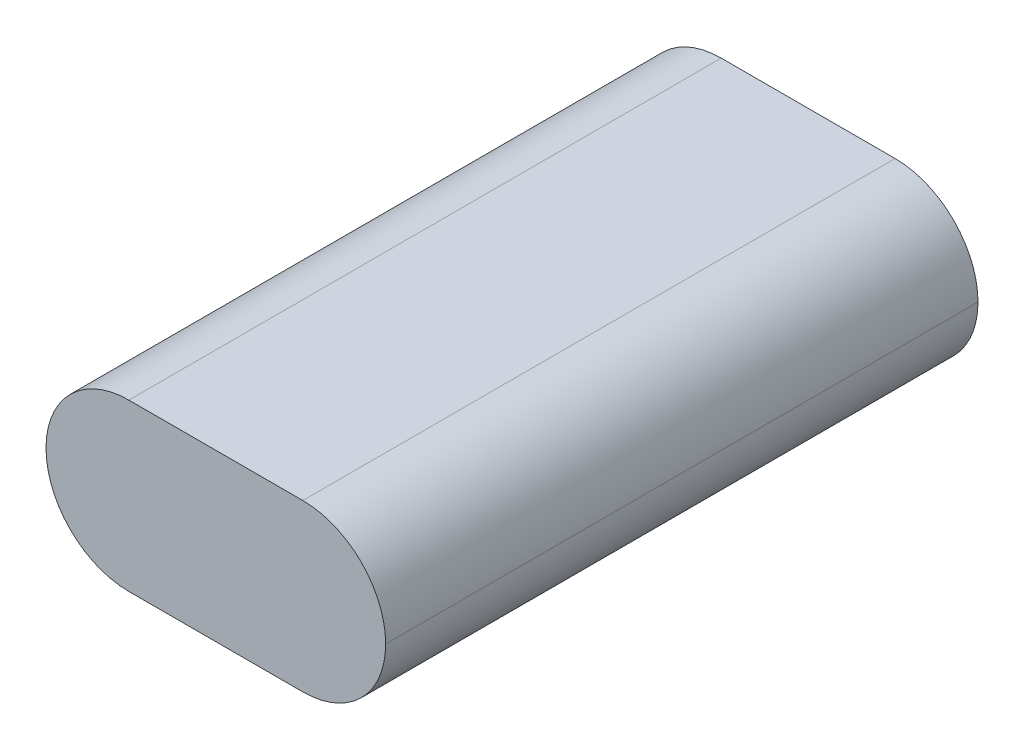
ISO-10303-21;
HEADER;
FILE_DESCRIPTION(('STEP AP214'),'2;1');
FILE_NAME('part.step','',(''),(''),'','','');
FILE_SCHEMA(('AUTOMOTIVE_DESIGN { 1 0 10303 214 1 1 1 1 }'));
ENDSEC;
DATA;
#1=APPLICATION_CONTEXT('core data for automotive mechanical design processes');
#2=APPLICATION_PROTOCOL_DEFINITION('international standard','automotive_design',2000,#1);
#3=PRODUCT_CONTEXT('',#1,'mechanical');
#4=PRODUCT('Part','Part','',(#3));
#5=PRODUCT_RELATED_PRODUCT_CATEGORY('part','',(#4));
#6=PRODUCT_DEFINITION_FORMATION('','',#4);
#7=PRODUCT_DEFINITION_CONTEXT('part definition',#1,'design');
#8=PRODUCT_DEFINITION('design','',#6,#7);
#9=PRODUCT_DEFINITION_SHAPE('','',#8);
#10=(LENGTH_UNIT() NAMED_UNIT(*) SI_UNIT(.MILLI.,.METRE.));
#11=(NAMED_UNIT(*) PLANE_ANGLE_UNIT() SI_UNIT($,.RADIAN.));
#12=(NAMED_UNIT(*) SI_UNIT($,.STERADIAN.) SOLID_ANGLE_UNIT());
#13=UNCERTAINTY_MEASURE_WITH_UNIT(LENGTH_MEASURE(1.E-05),#10,'distance_accuracy_value','');
#14=(GEOMETRIC_REPRESENTATION_CONTEXT(3) GLOBAL_UNCERTAINTY_ASSIGNED_CONTEXT((#13)) GLOBAL_UNIT_ASSIGNED_CONTEXT((#10,
#11,#12)) REPRESENTATION_CONTEXT('',''));
#15=CARTESIAN_POINT('',(0.,0.,0.));
#16=DIRECTION('',(0.,0.,1.));
#17=DIRECTION('',(1.,0.,0.));
#18=AXIS2_PLACEMENT_3D('',#15,#16,#17);
#19=CARTESIAN_POINT('',(-18.75,9.15,-32.7));
#20=DIRECTION('',(0.,0.,1.));
#21=DIRECTION('',(1.,0.,0.));
#22=AXIS2_PLACEMENT_3D('',#19,#20,#21);
#23=PLANE('',#22);
#24=CARTESIAN_POINT('',(9.6,0.,-32.7));
#25=DIRECTION('',(0.,0.,1.));
#26=DIRECTION('',(1.,0.,0.));
#27=AXIS2_PLACEMENT_3D('',#24,#25,#26);
#28=CIRCLE('',#27,9.15);
#29=CARTESIAN_POINT('',(9.6,9.15,-32.7));
#30=VERTEX_POINT('',#29);
#31=CARTESIAN_POINT('',(18.75,0.,-32.7));
#32=VERTEX_POINT('',#31);
#33=EDGE_CURVE('E92',#30,#32,#28,.F.);
#34=ORIENTED_EDGE('',*,*,#33,.T.);
#35=CARTESIAN_POINT('',(9.6,0.,-32.7));
#36=DIRECTION('',(0.,0.,1.));
#37=DIRECTION('',(1.,0.,0.));
#38=AXIS2_PLACEMENT_3D('',#35,#36,#37);
#39=CIRCLE('',#38,9.15);
#40=CARTESIAN_POINT('',(9.6,-9.15,-32.7));
#41=VERTEX_POINT('',#40);
#42=EDGE_CURVE('E87',#32,#41,#39,.F.);
#43=ORIENTED_EDGE('',*,*,#42,.T.);
#44=DIRECTION('',(-1.,0.,0.));
#45=VECTOR('',#44,1.);
#46=CARTESIAN_POINT('',(-18.75,-9.15,-32.7));
#47=LINE('',#46,#45);
#48=CARTESIAN_POINT('',(-9.6,-9.15,-32.7));
#49=VERTEX_POINT('',#48);
#50=EDGE_CURVE('E89',#41,#49,#47,.T.);
#51=ORIENTED_EDGE('',*,*,#50,.T.);
#52=CARTESIAN_POINT('',(-9.6,0.,-32.7));
#53=DIRECTION('',(0.,0.,1.));
#54=DIRECTION('',(1.,0.,0.));
#55=AXIS2_PLACEMENT_3D('',#52,#53,#54);
#56=CIRCLE('',#55,9.15);
#57=CARTESIAN_POINT('',(-18.75,0.,-32.7));
#58=VERTEX_POINT('',#57);
#59=EDGE_CURVE('E124',#49,#58,#56,.F.);
#60=ORIENTED_EDGE('',*,*,#59,.T.);
#61=CARTESIAN_POINT('',(-9.6,0.,-32.7));
#62=DIRECTION('',(0.,0.,1.));
#63=DIRECTION('',(1.,0.,0.));
#64=AXIS2_PLACEMENT_3D('',#61,#62,#63);
#65=CIRCLE('',#64,9.15);
#66=CARTESIAN_POINT('',(-9.6,9.15,-32.7));
#67=VERTEX_POINT('',#66);
#68=EDGE_CURVE('E128',#58,#67,#65,.F.);
#69=ORIENTED_EDGE('',*,*,#68,.T.);
#70=DIRECTION('',(-1.,0.,0.));
#71=VECTOR('',#70,1.);
#72=CARTESIAN_POINT('',(-18.75,9.15,-32.7));
#73=LINE('',#72,#71);
#74=EDGE_CURVE('E133',#30,#67,#73,.T.);
#75=ORIENTED_EDGE('',*,*,#74,.F.);
#76=EDGE_LOOP('',(#34,#43,#51,#60,#69,#75));
#77=FACE_BOUND('',#76,.T.);
#78=ADVANCED_FACE('F33',(#77),#23,.F.);
#79=CARTESIAN_POINT('',(-18.75,9.15,32.7));
#80=DIRECTION('',(0.,0.,-1.));
#81=DIRECTION('',(-1.,0.,0.));
#82=AXIS2_PLACEMENT_3D('',#79,#80,#81);
#83=PLANE('',#82);
#84=DIRECTION('',(1.,0.,0.));
#85=VECTOR('',#84,1.);
#86=CARTESIAN_POINT('',(-18.75,-9.15,32.7));
#87=LINE('',#86,#85);
#88=CARTESIAN_POINT('',(-9.6,-9.15,32.7));
#89=VERTEX_POINT('',#88);
#90=CARTESIAN_POINT('',(9.6,-9.15,32.7));
#91=VERTEX_POINT('',#90);
#92=EDGE_CURVE('E107',#89,#91,#87,.T.);
#93=ORIENTED_EDGE('',*,*,#92,.T.);
#94=CARTESIAN_POINT('',(9.6,0.,32.7));
#95=DIRECTION('',(0.,0.,-1.));
#96=DIRECTION('',(-1.,0.,0.));
#97=AXIS2_PLACEMENT_3D('',#94,#95,#96);
#98=CIRCLE('',#97,9.15);
#99=CARTESIAN_POINT('',(18.75,0.,32.7));
#100=VERTEX_POINT('',#99);
#101=EDGE_CURVE('E111',#91,#100,#98,.F.);
#102=ORIENTED_EDGE('',*,*,#101,.T.);
#103=CARTESIAN_POINT('',(9.6,0.,32.7));
#104=DIRECTION('',(0.,0.,-1.));
#105=DIRECTION('',(-1.,0.,0.));
#106=AXIS2_PLACEMENT_3D('',#103,#104,#105);
#107=CIRCLE('',#106,9.15);
#108=CARTESIAN_POINT('',(9.6,9.15,32.7));
#109=VERTEX_POINT('',#108);
#110=EDGE_CURVE('E56',#100,#109,#107,.F.);
#111=ORIENTED_EDGE('',*,*,#110,.T.);
#112=DIRECTION('',(1.,0.,0.));
#113=VECTOR('',#112,1.);
#114=CARTESIAN_POINT('',(-18.75,9.15,32.7));
#115=LINE('',#114,#113);
#116=CARTESIAN_POINT('',(-9.6,9.15,32.7));
#117=VERTEX_POINT('',#116);
#118=EDGE_CURVE('E130',#117,#109,#115,.T.);
#119=ORIENTED_EDGE('',*,*,#118,.F.);
#120=CARTESIAN_POINT('',(-9.6,0.,32.7));
#121=DIRECTION('',(0.,0.,-1.));
#122=DIRECTION('',(-1.,0.,0.));
#123=AXIS2_PLACEMENT_3D('',#120,#121,#122);
#124=CIRCLE('',#123,9.15);
#125=CARTESIAN_POINT('',(-18.75,0.,32.7));
#126=VERTEX_POINT('',#125);
#127=EDGE_CURVE('E50',#117,#126,#124,.F.);
#128=ORIENTED_EDGE('',*,*,#127,.T.);
#129=CARTESIAN_POINT('',(-9.6,0.,32.7));
#130=DIRECTION('',(0.,0.,-1.));
#131=DIRECTION('',(-1.,0.,0.));
#132=AXIS2_PLACEMENT_3D('',#129,#130,#131);
#133=CIRCLE('',#132,9.15);
#134=EDGE_CURVE('E113',#126,#89,#133,.F.);
#135=ORIENTED_EDGE('',*,*,#134,.T.);
#136=EDGE_LOOP('',(#93,#102,#111,#119,#128,#135));
#137=FACE_BOUND('',#136,.T.);
#138=ADVANCED_FACE('F152',(#137),#83,.F.);
#139=CARTESIAN_POINT('',(0.,9.15,0.));
#140=DIRECTION('',(0.,1.,0.));
#141=DIRECTION('',(0.,0.,1.));
#142=AXIS2_PLACEMENT_3D('',#139,#140,#141);
#143=PLANE('',#142);
#144=ORIENTED_EDGE('',*,*,#118,.T.);
#145=DIRECTION('',(0.,0.,-1.));
#146=VECTOR('',#145,1.);
#147=CARTESIAN_POINT('',(9.6,9.15,-32.7));
#148=LINE('',#147,#146);
#149=EDGE_CURVE('E11',#109,#30,#148,.T.);
#150=ORIENTED_EDGE('',*,*,#149,.T.);
#151=ORIENTED_EDGE('',*,*,#74,.T.);
#152=DIRECTION('',(0.,0.,1.));
#153=VECTOR('',#152,1.);
#154=CARTESIAN_POINT('',(-9.6,9.15,32.7));
#155=LINE('',#154,#153);
#156=EDGE_CURVE('E42',#67,#117,#155,.T.);
#157=ORIENTED_EDGE('',*,*,#156,.T.);
#158=EDGE_LOOP('',(#144,#150,#151,#157));
#159=FACE_BOUND('',#158,.T.);
#160=ADVANCED_FACE('F139',(#159),#143,.T.);
#161=CARTESIAN_POINT('',(0.,-9.15,0.));
#162=DIRECTION('',(0.,1.,0.));
#163=DIRECTION('',(0.,0.,1.));
#164=AXIS2_PLACEMENT_3D('',#161,#162,#163);
#165=PLANE('',#164);
#166=ORIENTED_EDGE('',*,*,#50,.F.);
#167=DIRECTION('',(0.,0.,-1.));
#168=VECTOR('',#167,1.);
#169=CARTESIAN_POINT('',(9.6,-9.15,0.));
#170=LINE('',#169,#168);
#171=EDGE_CURVE('E104',#41,#91,#170,.F.);
#172=ORIENTED_EDGE('',*,*,#171,.T.);
#173=ORIENTED_EDGE('',*,*,#92,.F.);
#174=DIRECTION('',(0.,0.,1.));
#175=VECTOR('',#174,1.);
#176=CARTESIAN_POINT('',(-9.6,-9.15,0.));
#177=LINE('',#176,#175);
#178=EDGE_CURVE('E97',#89,#49,#177,.F.);
#179=ORIENTED_EDGE('',*,*,#178,.T.);
#180=EDGE_LOOP('',(#166,#172,#173,#179));
#181=FACE_BOUND('',#180,.T.);
#182=ADVANCED_FACE('F102',(#181),#165,.F.);
#183=CARTESIAN_POINT('',(9.6,0.,0.));
#184=DIRECTION('',(0.,0.,1.));
#185=DIRECTION('',(1.,0.,0.));
#186=AXIS2_PLACEMENT_3D('',#183,#184,#185);
#187=CYLINDRICAL_SURFACE('',#186,9.15);
#188=ORIENTED_EDGE('',*,*,#149,.F.);
#189=ORIENTED_EDGE('',*,*,#110,.F.);
#190=DIRECTION('',(0.,0.,-1.));
#191=VECTOR('',#190,1.);
#192=CARTESIAN_POINT('',(18.75,0.,32.7));
#193=LINE('',#192,#191);
#194=EDGE_CURVE('E108',#32,#100,#193,.F.);
#195=ORIENTED_EDGE('',*,*,#194,.F.);
#196=ORIENTED_EDGE('',*,*,#33,.F.);
#197=EDGE_LOOP('',(#188,#189,#195,#196));
#198=FACE_BOUND('',#197,.T.);
#199=ADVANCED_FACE('F142',(#198),#187,.T.);
#200=CARTESIAN_POINT('',(9.6,0.,-32.7));
#201=DIRECTION('',(0.,0.,-1.));
#202=DIRECTION('',(-1.,0.,0.));
#203=AXIS2_PLACEMENT_3D('',#200,#201,#202);
#204=CYLINDRICAL_SURFACE('',#203,9.15);
#205=ORIENTED_EDGE('',*,*,#101,.F.);
#206=ORIENTED_EDGE('',*,*,#171,.F.);
#207=ORIENTED_EDGE('',*,*,#42,.F.);
#208=ORIENTED_EDGE('',*,*,#194,.T.);
#209=EDGE_LOOP('',(#205,#206,#207,#208));
#210=FACE_BOUND('',#209,.T.);
#211=ADVANCED_FACE('F110',(#210),#204,.T.);
#212=CARTESIAN_POINT('',(-9.6,0.,0.));
#213=DIRECTION('',(0.,0.,-1.));
#214=DIRECTION('',(-1.,0.,0.));
#215=AXIS2_PLACEMENT_3D('',#212,#213,#214);
#216=CYLINDRICAL_SURFACE('',#215,9.15);
#217=ORIENTED_EDGE('',*,*,#156,.F.);
#218=ORIENTED_EDGE('',*,*,#68,.F.);
#219=DIRECTION('',(0.,0.,1.));
#220=VECTOR('',#219,1.);
#221=CARTESIAN_POINT('',(-18.75,0.,-32.7));
#222=LINE('',#221,#220);
#223=EDGE_CURVE('E37',#126,#58,#222,.F.);
#224=ORIENTED_EDGE('',*,*,#223,.F.);
#225=ORIENTED_EDGE('',*,*,#127,.F.);
#226=EDGE_LOOP('',(#217,#218,#224,#225));
#227=FACE_BOUND('',#226,.T.);
#228=ADVANCED_FACE('F35',(#227),#216,.T.);
#229=CARTESIAN_POINT('',(-9.6,0.,-32.7));
#230=DIRECTION('',(0.,0.,1.));
#231=DIRECTION('',(1.,0.,0.));
#232=AXIS2_PLACEMENT_3D('',#229,#230,#231);
#233=CYLINDRICAL_SURFACE('',#232,9.15);
#234=ORIENTED_EDGE('',*,*,#59,.F.);
#235=ORIENTED_EDGE('',*,*,#178,.F.);
#236=ORIENTED_EDGE('',*,*,#134,.F.);
#237=ORIENTED_EDGE('',*,*,#223,.T.);
#238=EDGE_LOOP('',(#234,#235,#236,#237));
#239=FACE_BOUND('',#238,.T.);
#240=ADVANCED_FACE('F123',(#239),#233,.T.);
#241=CLOSED_SHELL('',(#78,#138,#160,#182,#199,#211,#228,#240));
#242=MANIFOLD_SOLID_BREP('B2',#241);
#243=ADVANCED_BREP_SHAPE_REPRESENTATION('',(#18,#242),#14);
#244=SHAPE_DEFINITION_REPRESENTATION(#9,#243);
ENDSEC;
END-ISO-10303-21;
